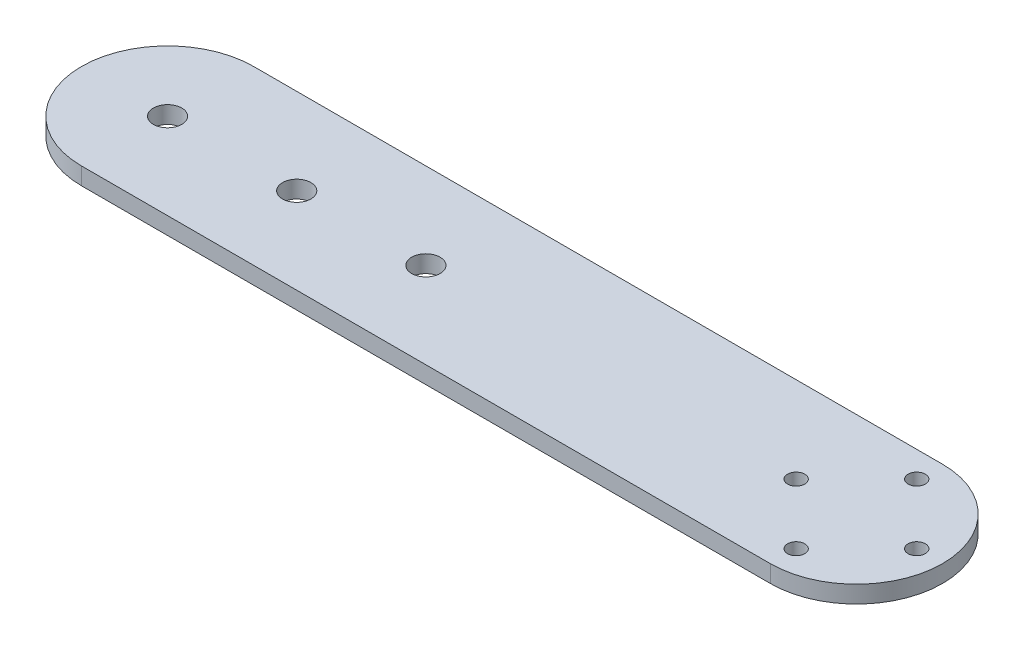
ISO-10303-21;
HEADER;
FILE_DESCRIPTION(('STEP AP214'),'2;1');
FILE_NAME('part.step','',(''),(''),'','','');
FILE_SCHEMA(('AUTOMOTIVE_DESIGN { 1 0 10303 214 1 1 1 1 }'));
ENDSEC;
DATA;
#1=APPLICATION_CONTEXT('core data for automotive mechanical design processes');
#2=APPLICATION_PROTOCOL_DEFINITION('international standard','automotive_design',2000,#1);
#3=PRODUCT_CONTEXT('',#1,'mechanical');
#4=PRODUCT('Part','Part','',(#3));
#5=PRODUCT_RELATED_PRODUCT_CATEGORY('part','',(#4));
#6=PRODUCT_DEFINITION_FORMATION('','',#4);
#7=PRODUCT_DEFINITION_CONTEXT('part definition',#1,'design');
#8=PRODUCT_DEFINITION('design','',#6,#7);
#9=PRODUCT_DEFINITION_SHAPE('','',#8);
#10=(LENGTH_UNIT() NAMED_UNIT(*) SI_UNIT(.MILLI.,.METRE.));
#11=(NAMED_UNIT(*) PLANE_ANGLE_UNIT() SI_UNIT($,.RADIAN.));
#12=(NAMED_UNIT(*) SI_UNIT($,.STERADIAN.) SOLID_ANGLE_UNIT());
#13=UNCERTAINTY_MEASURE_WITH_UNIT(LENGTH_MEASURE(1.E-05),#10,'distance_accuracy_value','');
#14=(GEOMETRIC_REPRESENTATION_CONTEXT(3) GLOBAL_UNCERTAINTY_ASSIGNED_CONTEXT((#13)) GLOBAL_UNIT_ASSIGNED_CONTEXT((#10,
#11,#12)) REPRESENTATION_CONTEXT('',''));
#15=CARTESIAN_POINT('',(0.,0.,0.));
#16=DIRECTION('',(0.,0.,1.));
#17=DIRECTION('',(1.,0.,0.));
#18=AXIS2_PLACEMENT_3D('',#15,#16,#17);
#19=CARTESIAN_POINT('',(0.,2.,0.));
#20=DIRECTION('',(0.,1.,0.));
#21=DIRECTION('',(0.,0.,1.));
#22=AXIS2_PLACEMENT_3D('',#19,#20,#21);
#23=PLANE('',#22);
#24=CARTESIAN_POINT('',(73.,2.,0.));
#25=DIRECTION('',(0.,1.,0.));
#26=DIRECTION('',(0.,0.,1.));
#27=AXIS2_PLACEMENT_3D('',#24,#25,#26);
#28=CIRCLE('',#27,0.999999999999998);
#29=CARTESIAN_POINT('',(73.,2.,0.999999999999998));
#30=VERTEX_POINT('',#29);
#31=EDGE_CURVE('E140',#30,#30,#28,.T.);
#32=ORIENTED_EDGE('',*,*,#31,.F.);
#33=EDGE_LOOP('',(#32));
#34=FACE_BOUND('',#33,.T.);
#35=CARTESIAN_POINT('',(80.,2.,-7.00000000000001));
#36=DIRECTION('',(0.,1.,0.));
#37=DIRECTION('',(0.,0.,1.));
#38=AXIS2_PLACEMENT_3D('',#35,#36,#37);
#39=CIRCLE('',#38,0.999999999999998);
#40=CARTESIAN_POINT('',(80.,2.,-6.00000000000002));
#41=VERTEX_POINT('',#40);
#42=EDGE_CURVE('E128',#41,#41,#39,.T.);
#43=ORIENTED_EDGE('',*,*,#42,.F.);
#44=EDGE_LOOP('',(#43));
#45=FACE_BOUND('',#44,.T.);
#46=CARTESIAN_POINT('',(0.,2.,0.));
#47=DIRECTION('',(0.,1.,0.));
#48=DIRECTION('',(0.,0.,1.));
#49=AXIS2_PLACEMENT_3D('',#46,#47,#48);
#50=CIRCLE('',#49,1.65);
#51=CARTESIAN_POINT('',(0.,2.,1.65));
#52=VERTEX_POINT('',#51);
#53=EDGE_CURVE('E116',#52,#52,#50,.T.);
#54=ORIENTED_EDGE('',*,*,#53,.F.);
#55=EDGE_LOOP('',(#54));
#56=FACE_BOUND('',#55,.T.);
#57=CARTESIAN_POINT('',(0.,2.,0.));
#58=DIRECTION('',(0.,1.,0.));
#59=DIRECTION('',(0.,0.,1.));
#60=AXIS2_PLACEMENT_3D('',#57,#58,#59);
#61=CIRCLE('',#60,10.);
#62=CARTESIAN_POINT('',(0.,2.,-10.));
#63=VERTEX_POINT('',#62);
#64=CARTESIAN_POINT('',(0.,2.,10.));
#65=VERTEX_POINT('',#64);
#66=EDGE_CURVE('E86',#63,#65,#61,.T.);
#67=ORIENTED_EDGE('',*,*,#66,.T.);
#68=DIRECTION('',(1.,0.,0.));
#69=VECTOR('',#68,1.);
#70=CARTESIAN_POINT('',(0.,2.,10.));
#71=LINE('',#70,#69);
#72=CARTESIAN_POINT('',(80.,2.,10.));
#73=VERTEX_POINT('',#72);
#74=EDGE_CURVE('E81',#65,#73,#71,.T.);
#75=ORIENTED_EDGE('',*,*,#74,.T.);
#76=CARTESIAN_POINT('',(80.,2.,0.));
#77=DIRECTION('',(0.,1.,0.));
#78=DIRECTION('',(0.,0.,1.));
#79=AXIS2_PLACEMENT_3D('',#76,#77,#78);
#80=CIRCLE('',#79,10.);
#81=CARTESIAN_POINT('',(80.,2.,-10.));
#82=VERTEX_POINT('',#81);
#83=EDGE_CURVE('E84',#73,#82,#80,.T.);
#84=ORIENTED_EDGE('',*,*,#83,.T.);
#85=DIRECTION('',(-1.,0.,0.));
#86=VECTOR('',#85,1.);
#87=CARTESIAN_POINT('',(0.,2.,-10.));
#88=LINE('',#87,#86);
#89=EDGE_CURVE('E51',#82,#63,#88,.T.);
#90=ORIENTED_EDGE('',*,*,#89,.T.);
#91=EDGE_LOOP('',(#67,#75,#84,#90));
#92=FACE_BOUND('',#91,.T.);
#93=CARTESIAN_POINT('',(30.,2.,0.));
#94=DIRECTION('',(0.,1.,0.));
#95=DIRECTION('',(0.,0.,1.));
#96=AXIS2_PLACEMENT_3D('',#93,#94,#95);
#97=CIRCLE('',#96,1.65);
#98=CARTESIAN_POINT('',(30.,2.,1.65));
#99=VERTEX_POINT('',#98);
#100=EDGE_CURVE('E101',#99,#99,#97,.T.);
#101=ORIENTED_EDGE('',*,*,#100,.F.);
#102=EDGE_LOOP('',(#101));
#103=FACE_BOUND('',#102,.T.);
#104=CARTESIAN_POINT('',(15.,2.,0.));
#105=DIRECTION('',(0.,1.,0.));
#106=DIRECTION('',(0.,0.,1.));
#107=AXIS2_PLACEMENT_3D('',#104,#105,#106);
#108=CIRCLE('',#107,1.65);
#109=CARTESIAN_POINT('',(15.,2.,1.65));
#110=VERTEX_POINT('',#109);
#111=EDGE_CURVE('E122',#110,#110,#108,.T.);
#112=ORIENTED_EDGE('',*,*,#111,.F.);
#113=EDGE_LOOP('',(#112));
#114=FACE_BOUND('',#113,.T.);
#115=CARTESIAN_POINT('',(87.,2.,0.));
#116=DIRECTION('',(0.,1.,0.));
#117=DIRECTION('',(0.,0.,1.));
#118=AXIS2_PLACEMENT_3D('',#115,#116,#117);
#119=CIRCLE('',#118,0.999999999999998);
#120=CARTESIAN_POINT('',(87.,2.,0.999999999999998));
#121=VERTEX_POINT('',#120);
#122=EDGE_CURVE('E134',#121,#121,#119,.T.);
#123=ORIENTED_EDGE('',*,*,#122,.F.);
#124=EDGE_LOOP('',(#123));
#125=FACE_BOUND('',#124,.T.);
#126=CARTESIAN_POINT('',(80.,2.,7.00000000000001));
#127=DIRECTION('',(0.,1.,0.));
#128=DIRECTION('',(0.,0.,1.));
#129=AXIS2_PLACEMENT_3D('',#126,#127,#128);
#130=CIRCLE('',#129,0.999999999999998);
#131=CARTESIAN_POINT('',(80.,2.,8.00000000000001));
#132=VERTEX_POINT('',#131);
#133=EDGE_CURVE('E146',#132,#132,#130,.T.);
#134=ORIENTED_EDGE('',*,*,#133,.F.);
#135=EDGE_LOOP('',(#134));
#136=FACE_BOUND('',#135,.T.);
#137=ADVANCED_FACE('F34',(#34,#45,#56,#92,#103,#114,#125,#136),#23,.T.);
#138=CARTESIAN_POINT('',(0.,0.,0.));
#139=DIRECTION('',(0.,1.,0.));
#140=DIRECTION('',(0.,0.,1.));
#141=AXIS2_PLACEMENT_3D('',#138,#139,#140);
#142=PLANE('',#141);
#143=CARTESIAN_POINT('',(0.,0.,0.));
#144=DIRECTION('',(0.,1.,0.));
#145=DIRECTION('',(0.,0.,1.));
#146=AXIS2_PLACEMENT_3D('',#143,#144,#145);
#147=CIRCLE('',#146,10.);
#148=CARTESIAN_POINT('',(0.,0.,-10.));
#149=VERTEX_POINT('',#148);
#150=CARTESIAN_POINT('',(0.,0.,10.));
#151=VERTEX_POINT('',#150);
#152=EDGE_CURVE('E98',#149,#151,#147,.T.);
#153=ORIENTED_EDGE('',*,*,#152,.F.);
#154=DIRECTION('',(-1.,0.,0.));
#155=VECTOR('',#154,1.);
#156=CARTESIAN_POINT('',(0.,0.,-10.));
#157=LINE('',#156,#155);
#158=CARTESIAN_POINT('',(80.,0.,-10.));
#159=VERTEX_POINT('',#158);
#160=EDGE_CURVE('E74',#159,#149,#157,.T.);
#161=ORIENTED_EDGE('',*,*,#160,.F.);
#162=CARTESIAN_POINT('',(80.,0.,0.));
#163=DIRECTION('',(0.,1.,0.));
#164=DIRECTION('',(0.,0.,1.));
#165=AXIS2_PLACEMENT_3D('',#162,#163,#164);
#166=CIRCLE('',#165,10.);
#167=CARTESIAN_POINT('',(80.,0.,10.));
#168=VERTEX_POINT('',#167);
#169=EDGE_CURVE('E68',#168,#159,#166,.T.);
#170=ORIENTED_EDGE('',*,*,#169,.F.);
#171=DIRECTION('',(1.,0.,0.));
#172=VECTOR('',#171,1.);
#173=CARTESIAN_POINT('',(0.,0.,10.));
#174=LINE('',#173,#172);
#175=EDGE_CURVE('E90',#151,#168,#174,.T.);
#176=ORIENTED_EDGE('',*,*,#175,.F.);
#177=EDGE_LOOP('',(#153,#161,#170,#176));
#178=FACE_BOUND('',#177,.T.);
#179=CARTESIAN_POINT('',(30.,0.,0.));
#180=DIRECTION('',(0.,1.,0.));
#181=DIRECTION('',(0.,0.,1.));
#182=AXIS2_PLACEMENT_3D('',#179,#180,#181);
#183=CIRCLE('',#182,1.65);
#184=CARTESIAN_POINT('',(30.,0.,1.65));
#185=VERTEX_POINT('',#184);
#186=EDGE_CURVE('E113',#185,#185,#183,.T.);
#187=ORIENTED_EDGE('',*,*,#186,.T.);
#188=EDGE_LOOP('',(#187));
#189=FACE_BOUND('',#188,.T.);
#190=CARTESIAN_POINT('',(0.,0.,0.));
#191=DIRECTION('',(0.,1.,0.));
#192=DIRECTION('',(0.,0.,1.));
#193=AXIS2_PLACEMENT_3D('',#190,#191,#192);
#194=CIRCLE('',#193,1.65);
#195=CARTESIAN_POINT('',(0.,0.,1.65));
#196=VERTEX_POINT('',#195);
#197=EDGE_CURVE('E119',#196,#196,#194,.T.);
#198=ORIENTED_EDGE('',*,*,#197,.T.);
#199=EDGE_LOOP('',(#198));
#200=FACE_BOUND('',#199,.T.);
#201=CARTESIAN_POINT('',(15.,0.,0.));
#202=DIRECTION('',(0.,1.,0.));
#203=DIRECTION('',(0.,0.,1.));
#204=AXIS2_PLACEMENT_3D('',#201,#202,#203);
#205=CIRCLE('',#204,1.65);
#206=CARTESIAN_POINT('',(15.,0.,1.65));
#207=VERTEX_POINT('',#206);
#208=EDGE_CURVE('E125',#207,#207,#205,.T.);
#209=ORIENTED_EDGE('',*,*,#208,.T.);
#210=EDGE_LOOP('',(#209));
#211=FACE_BOUND('',#210,.T.);
#212=CARTESIAN_POINT('',(80.,0.,-7.00000000000001));
#213=DIRECTION('',(0.,1.,0.));
#214=DIRECTION('',(0.,0.,1.));
#215=AXIS2_PLACEMENT_3D('',#212,#213,#214);
#216=CIRCLE('',#215,0.999999999999998);
#217=CARTESIAN_POINT('',(80.,0.,-6.00000000000002));
#218=VERTEX_POINT('',#217);
#219=EDGE_CURVE('E131',#218,#218,#216,.T.);
#220=ORIENTED_EDGE('',*,*,#219,.T.);
#221=EDGE_LOOP('',(#220));
#222=FACE_BOUND('',#221,.T.);
#223=CARTESIAN_POINT('',(87.,0.,0.));
#224=DIRECTION('',(0.,1.,0.));
#225=DIRECTION('',(0.,0.,1.));
#226=AXIS2_PLACEMENT_3D('',#223,#224,#225);
#227=CIRCLE('',#226,0.999999999999998);
#228=CARTESIAN_POINT('',(87.,0.,0.999999999999998));
#229=VERTEX_POINT('',#228);
#230=EDGE_CURVE('E137',#229,#229,#227,.T.);
#231=ORIENTED_EDGE('',*,*,#230,.T.);
#232=EDGE_LOOP('',(#231));
#233=FACE_BOUND('',#232,.T.);
#234=CARTESIAN_POINT('',(73.,0.,0.));
#235=DIRECTION('',(0.,1.,0.));
#236=DIRECTION('',(0.,0.,1.));
#237=AXIS2_PLACEMENT_3D('',#234,#235,#236);
#238=CIRCLE('',#237,0.999999999999998);
#239=CARTESIAN_POINT('',(73.,0.,0.999999999999998));
#240=VERTEX_POINT('',#239);
#241=EDGE_CURVE('E143',#240,#240,#238,.T.);
#242=ORIENTED_EDGE('',*,*,#241,.T.);
#243=EDGE_LOOP('',(#242));
#244=FACE_BOUND('',#243,.T.);
#245=CARTESIAN_POINT('',(80.,0.,7.00000000000001));
#246=DIRECTION('',(0.,1.,0.));
#247=DIRECTION('',(0.,0.,1.));
#248=AXIS2_PLACEMENT_3D('',#245,#246,#247);
#249=CIRCLE('',#248,0.999999999999998);
#250=CARTESIAN_POINT('',(80.,0.,8.00000000000001));
#251=VERTEX_POINT('',#250);
#252=EDGE_CURVE('E149',#251,#251,#249,.T.);
#253=ORIENTED_EDGE('',*,*,#252,.T.);
#254=EDGE_LOOP('',(#253));
#255=FACE_BOUND('',#254,.T.);
#256=ADVANCED_FACE('F109',(#178,#189,#200,#211,#222,#233,#244,#255),#142,.F.);
#257=CARTESIAN_POINT('',(0.,2.,0.));
#258=DIRECTION('',(0.,-1.,0.));
#259=DIRECTION('',(0.,0.,-1.));
#260=AXIS2_PLACEMENT_3D('',#257,#258,#259);
#261=CYLINDRICAL_SURFACE('',#260,10.);
#262=ORIENTED_EDGE('',*,*,#152,.T.);
#263=DIRECTION('',(0.,-1.,0.));
#264=VECTOR('',#263,1.);
#265=CARTESIAN_POINT('',(0.,2.,10.));
#266=LINE('',#265,#264);
#267=EDGE_CURVE('E11',#65,#151,#266,.T.);
#268=ORIENTED_EDGE('',*,*,#267,.F.);
#269=ORIENTED_EDGE('',*,*,#66,.F.);
#270=DIRECTION('',(0.,-1.,0.));
#271=VECTOR('',#270,1.);
#272=CARTESIAN_POINT('',(0.,2.,-10.));
#273=LINE('',#272,#271);
#274=EDGE_CURVE('E94',#63,#149,#273,.T.);
#275=ORIENTED_EDGE('',*,*,#274,.T.);
#276=EDGE_LOOP('',(#262,#268,#269,#275));
#277=FACE_BOUND('',#276,.T.);
#278=ADVANCED_FACE('F36',(#277),#261,.T.);
#279=CARTESIAN_POINT('',(0.,2.,10.));
#280=DIRECTION('',(0.,0.,-1.));
#281=DIRECTION('',(-1.,0.,0.));
#282=AXIS2_PLACEMENT_3D('',#279,#280,#281);
#283=PLANE('',#282);
#284=ORIENTED_EDGE('',*,*,#175,.T.);
#285=DIRECTION('',(0.,-1.,0.));
#286=VECTOR('',#285,1.);
#287=CARTESIAN_POINT('',(80.,2.,10.));
#288=LINE('',#287,#286);
#289=EDGE_CURVE('E43',#73,#168,#288,.T.);
#290=ORIENTED_EDGE('',*,*,#289,.F.);
#291=ORIENTED_EDGE('',*,*,#74,.F.);
#292=ORIENTED_EDGE('',*,*,#267,.T.);
#293=EDGE_LOOP('',(#284,#290,#291,#292));
#294=FACE_BOUND('',#293,.T.);
#295=ADVANCED_FACE('F89',(#294),#283,.F.);
#296=CARTESIAN_POINT('',(80.,2.,0.));
#297=DIRECTION('',(0.,-1.,0.));
#298=DIRECTION('',(0.,0.,-1.));
#299=AXIS2_PLACEMENT_3D('',#296,#297,#298);
#300=CYLINDRICAL_SURFACE('',#299,10.);
#301=ORIENTED_EDGE('',*,*,#169,.T.);
#302=DIRECTION('',(0.,-1.,0.));
#303=VECTOR('',#302,1.);
#304=CARTESIAN_POINT('',(80.,2.,-10.));
#305=LINE('',#304,#303);
#306=EDGE_CURVE('E91',#82,#159,#305,.T.);
#307=ORIENTED_EDGE('',*,*,#306,.F.);
#308=ORIENTED_EDGE('',*,*,#83,.F.);
#309=ORIENTED_EDGE('',*,*,#289,.T.);
#310=EDGE_LOOP('',(#301,#307,#308,#309));
#311=FACE_BOUND('',#310,.T.);
#312=ADVANCED_FACE('F92',(#311),#300,.T.);
#313=CARTESIAN_POINT('',(0.,2.,-10.));
#314=DIRECTION('',(0.,0.,1.));
#315=DIRECTION('',(1.,0.,0.));
#316=AXIS2_PLACEMENT_3D('',#313,#314,#315);
#317=PLANE('',#316);
#318=ORIENTED_EDGE('',*,*,#160,.T.);
#319=ORIENTED_EDGE('',*,*,#274,.F.);
#320=ORIENTED_EDGE('',*,*,#89,.F.);
#321=ORIENTED_EDGE('',*,*,#306,.T.);
#322=EDGE_LOOP('',(#318,#319,#320,#321));
#323=FACE_BOUND('',#322,.T.);
#324=ADVANCED_FACE('F106',(#323),#317,.F.);
#325=CARTESIAN_POINT('',(30.,2.,0.));
#326=DIRECTION('',(0.,-1.,0.));
#327=DIRECTION('',(0.,0.,-1.));
#328=AXIS2_PLACEMENT_3D('',#325,#326,#327);
#329=CYLINDRICAL_SURFACE('',#328,1.65);
#330=ORIENTED_EDGE('',*,*,#100,.T.);
#331=EDGE_LOOP('',(#330));
#332=FACE_BOUND('',#331,.T.);
#333=ORIENTED_EDGE('',*,*,#186,.F.);
#334=EDGE_LOOP('',(#333));
#335=FACE_BOUND('',#334,.T.);
#336=ADVANCED_FACE('F168',(#332,#335),#329,.F.);
#337=CARTESIAN_POINT('',(0.,2.,0.));
#338=DIRECTION('',(0.,-1.,0.));
#339=DIRECTION('',(0.,0.,-1.));
#340=AXIS2_PLACEMENT_3D('',#337,#338,#339);
#341=CYLINDRICAL_SURFACE('',#340,1.65);
#342=ORIENTED_EDGE('',*,*,#53,.T.);
#343=EDGE_LOOP('',(#342));
#344=FACE_BOUND('',#343,.T.);
#345=ORIENTED_EDGE('',*,*,#197,.F.);
#346=EDGE_LOOP('',(#345));
#347=FACE_BOUND('',#346,.T.);
#348=ADVANCED_FACE('F214',(#344,#347),#341,.F.);
#349=CARTESIAN_POINT('',(15.,2.,0.));
#350=DIRECTION('',(0.,-1.,0.));
#351=DIRECTION('',(0.,0.,-1.));
#352=AXIS2_PLACEMENT_3D('',#349,#350,#351);
#353=CYLINDRICAL_SURFACE('',#352,1.65);
#354=ORIENTED_EDGE('',*,*,#111,.T.);
#355=EDGE_LOOP('',(#354));
#356=FACE_BOUND('',#355,.T.);
#357=ORIENTED_EDGE('',*,*,#208,.F.);
#358=EDGE_LOOP('',(#357));
#359=FACE_BOUND('',#358,.T.);
#360=ADVANCED_FACE('F222',(#356,#359),#353,.F.);
#361=CARTESIAN_POINT('',(80.,2.,-7.00000000000001));
#362=DIRECTION('',(0.,-1.,0.));
#363=DIRECTION('',(0.,0.,-1.));
#364=AXIS2_PLACEMENT_3D('',#361,#362,#363);
#365=CYLINDRICAL_SURFACE('',#364,0.999999999999998);
#366=ORIENTED_EDGE('',*,*,#42,.T.);
#367=EDGE_LOOP('',(#366));
#368=FACE_BOUND('',#367,.T.);
#369=ORIENTED_EDGE('',*,*,#219,.F.);
#370=EDGE_LOOP('',(#369));
#371=FACE_BOUND('',#370,.T.);
#372=ADVANCED_FACE('F230',(#368,#371),#365,.F.);
#373=CARTESIAN_POINT('',(87.,2.,0.));
#374=DIRECTION('',(0.,-1.,0.));
#375=DIRECTION('',(0.,0.,-1.));
#376=AXIS2_PLACEMENT_3D('',#373,#374,#375);
#377=CYLINDRICAL_SURFACE('',#376,0.999999999999998);
#378=ORIENTED_EDGE('',*,*,#122,.T.);
#379=EDGE_LOOP('',(#378));
#380=FACE_BOUND('',#379,.T.);
#381=ORIENTED_EDGE('',*,*,#230,.F.);
#382=EDGE_LOOP('',(#381));
#383=FACE_BOUND('',#382,.T.);
#384=ADVANCED_FACE('F239',(#380,#383),#377,.F.);
#385=CARTESIAN_POINT('',(73.,2.,0.));
#386=DIRECTION('',(0.,-1.,0.));
#387=DIRECTION('',(0.,0.,-1.));
#388=AXIS2_PLACEMENT_3D('',#385,#386,#387);
#389=CYLINDRICAL_SURFACE('',#388,0.999999999999998);
#390=ORIENTED_EDGE('',*,*,#31,.T.);
#391=EDGE_LOOP('',(#390));
#392=FACE_BOUND('',#391,.T.);
#393=ORIENTED_EDGE('',*,*,#241,.F.);
#394=EDGE_LOOP('',(#393));
#395=FACE_BOUND('',#394,.T.);
#396=ADVANCED_FACE('F248',(#392,#395),#389,.F.);
#397=CARTESIAN_POINT('',(80.,2.,7.00000000000001));
#398=DIRECTION('',(0.,-1.,0.));
#399=DIRECTION('',(0.,0.,-1.));
#400=AXIS2_PLACEMENT_3D('',#397,#398,#399);
#401=CYLINDRICAL_SURFACE('',#400,0.999999999999998);
#402=ORIENTED_EDGE('',*,*,#133,.T.);
#403=EDGE_LOOP('',(#402));
#404=FACE_BOUND('',#403,.T.);
#405=ORIENTED_EDGE('',*,*,#252,.F.);
#406=EDGE_LOOP('',(#405));
#407=FACE_BOUND('',#406,.T.);
#408=ADVANCED_FACE('F155',(#404,#407),#401,.F.);
#409=CLOSED_SHELL('',(#137,#256,#278,#295,#312,#324,#336,#348,#360,#372,#384,#396,#408));
#410=MANIFOLD_SOLID_BREP('B2',#409);
#411=ADVANCED_BREP_SHAPE_REPRESENTATION('',(#18,#410),#14);
#412=SHAPE_DEFINITION_REPRESENTATION(#9,#411);
ENDSEC;
END-ISO-10303-21;
